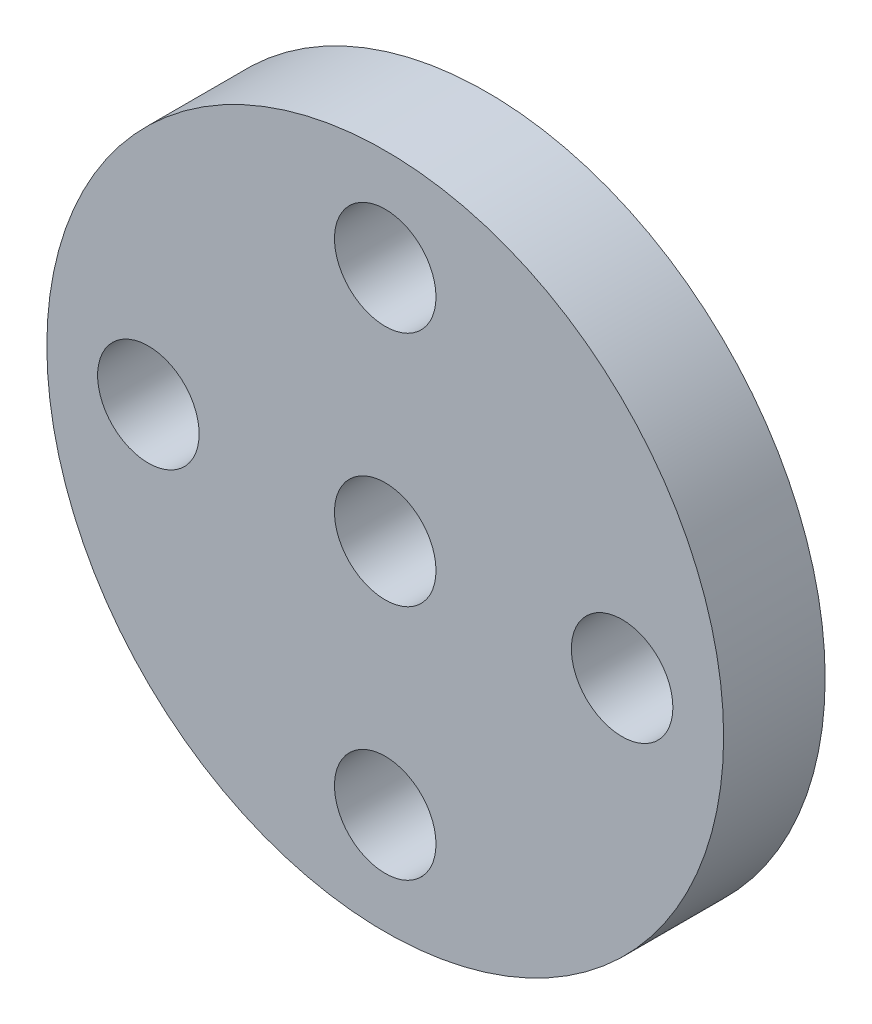
ISO-10303-21;
HEADER;
FILE_DESCRIPTION(('STEP AP214'),'2;1');
FILE_NAME('part.step','',(''),(''),'','','');
FILE_SCHEMA(('AUTOMOTIVE_DESIGN { 1 0 10303 214 1 1 1 1 }'));
ENDSEC;
DATA;
#1=APPLICATION_CONTEXT('core data for automotive mechanical design processes');
#2=APPLICATION_PROTOCOL_DEFINITION('international standard','automotive_design',2000,#1);
#3=PRODUCT_CONTEXT('',#1,'mechanical');
#4=PRODUCT('Part','Part','',(#3));
#5=PRODUCT_RELATED_PRODUCT_CATEGORY('part','',(#4));
#6=PRODUCT_DEFINITION_FORMATION('','',#4);
#7=PRODUCT_DEFINITION_CONTEXT('part definition',#1,'design');
#8=PRODUCT_DEFINITION('design','',#6,#7);
#9=PRODUCT_DEFINITION_SHAPE('','',#8);
#10=(LENGTH_UNIT() NAMED_UNIT(*) SI_UNIT(.MILLI.,.METRE.));
#11=(NAMED_UNIT(*) PLANE_ANGLE_UNIT() SI_UNIT($,.RADIAN.));
#12=(NAMED_UNIT(*) SI_UNIT($,.STERADIAN.) SOLID_ANGLE_UNIT());
#13=UNCERTAINTY_MEASURE_WITH_UNIT(LENGTH_MEASURE(1.E-05),#10,'distance_accuracy_value','');
#14=(GEOMETRIC_REPRESENTATION_CONTEXT(3) GLOBAL_UNCERTAINTY_ASSIGNED_CONTEXT((#13)) GLOBAL_UNIT_ASSIGNED_CONTEXT((#10,
#11,#12)) REPRESENTATION_CONTEXT('',''));
#15=CARTESIAN_POINT('',(0.,0.,0.));
#16=DIRECTION('',(0.,0.,1.));
#17=DIRECTION('',(1.,0.,0.));
#18=AXIS2_PLACEMENT_3D('',#15,#16,#17);
#19=CARTESIAN_POINT('',(0.,0.,3.));
#20=DIRECTION('',(0.,0.,1.));
#21=DIRECTION('',(1.,0.,0.));
#22=AXIS2_PLACEMENT_3D('',#19,#20,#21);
#23=PLANE('',#22);
#24=CARTESIAN_POINT('',(-7.00000000000001,0.,3.));
#25=DIRECTION('',(0.,0.,1.));
#26=DIRECTION('',(1.,0.,0.));
#27=AXIS2_PLACEMENT_3D('',#24,#25,#26);
#28=CIRCLE('',#27,1.5);
#29=CARTESIAN_POINT('',(-5.50000000000001,0.,3.));
#30=VERTEX_POINT('',#29);
#31=EDGE_CURVE('E72',#30,#30,#28,.T.);
#32=ORIENTED_EDGE('',*,*,#31,.F.);
#33=EDGE_LOOP('',(#32));
#34=FACE_BOUND('',#33,.T.);
#35=CARTESIAN_POINT('',(7.00000000000008,0.,3.));
#36=DIRECTION('',(0.,0.,1.));
#37=DIRECTION('',(1.,0.,0.));
#38=AXIS2_PLACEMENT_3D('',#35,#36,#37);
#39=CIRCLE('',#38,1.5);
#40=CARTESIAN_POINT('',(8.50000000000008,0.,3.));
#41=VERTEX_POINT('',#40);
#42=EDGE_CURVE('E56',#41,#41,#39,.T.);
#43=ORIENTED_EDGE('',*,*,#42,.F.);
#44=EDGE_LOOP('',(#43));
#45=FACE_BOUND('',#44,.T.);
#46=CARTESIAN_POINT('',(0.,0.,3.));
#47=DIRECTION('',(0.,0.,1.));
#48=DIRECTION('',(1.,0.,0.));
#49=AXIS2_PLACEMENT_3D('',#46,#47,#48);
#50=CIRCLE('',#49,10.);
#51=CARTESIAN_POINT('',(10.,0.,3.));
#52=VERTEX_POINT('',#51);
#53=EDGE_CURVE('E10',#52,#52,#50,.T.);
#54=ORIENTED_EDGE('',*,*,#53,.T.);
#55=EDGE_LOOP('',(#54));
#56=FACE_BOUND('',#55,.T.);
#57=CARTESIAN_POINT('',(0.,7.,3.));
#58=DIRECTION('',(0.,0.,1.));
#59=DIRECTION('',(1.,0.,0.));
#60=AXIS2_PLACEMENT_3D('',#57,#58,#59);
#61=CIRCLE('',#60,1.5);
#62=CARTESIAN_POINT('',(1.5,7.,3.));
#63=VERTEX_POINT('',#62);
#64=EDGE_CURVE('E50',#63,#63,#61,.T.);
#65=ORIENTED_EDGE('',*,*,#64,.F.);
#66=EDGE_LOOP('',(#65));
#67=FACE_BOUND('',#66,.T.);
#68=CARTESIAN_POINT('',(4.71844785465692E-13,-7.00000000000008,3.));
#69=DIRECTION('',(0.,0.,1.));
#70=DIRECTION('',(1.,0.,0.));
#71=AXIS2_PLACEMENT_3D('',#68,#69,#70);
#72=CIRCLE('',#71,1.50000000000043);
#73=CARTESIAN_POINT('',(1.5000000000009,-7.00000000000008,3.));
#74=VERTEX_POINT('',#73);
#75=EDGE_CURVE('E64',#74,#74,#72,.T.);
#76=ORIENTED_EDGE('',*,*,#75,.F.);
#77=EDGE_LOOP('',(#76));
#78=FACE_BOUND('',#77,.T.);
#79=CARTESIAN_POINT('',(0.,0.,3.));
#80=DIRECTION('',(0.,0.,1.));
#81=DIRECTION('',(1.,0.,0.));
#82=AXIS2_PLACEMENT_3D('',#79,#80,#81);
#83=CIRCLE('',#82,1.5);
#84=CARTESIAN_POINT('',(1.5,0.,3.));
#85=VERTEX_POINT('',#84);
#86=EDGE_CURVE('E80',#85,#85,#83,.T.);
#87=ORIENTED_EDGE('',*,*,#86,.F.);
#88=EDGE_LOOP('',(#87));
#89=FACE_BOUND('',#88,.T.);
#90=ADVANCED_FACE('F37',(#34,#45,#56,#67,#78,#89),#23,.T.);
#91=CARTESIAN_POINT('',(0.,0.,0.));
#92=DIRECTION('',(0.,0.,1.));
#93=DIRECTION('',(1.,0.,0.));
#94=AXIS2_PLACEMENT_3D('',#91,#92,#93);
#95=PLANE('',#94);
#96=CARTESIAN_POINT('',(0.,0.,0.));
#97=DIRECTION('',(0.,0.,1.));
#98=DIRECTION('',(1.,0.,0.));
#99=AXIS2_PLACEMENT_3D('',#96,#97,#98);
#100=CIRCLE('',#99,10.);
#101=CARTESIAN_POINT('',(10.,0.,0.));
#102=VERTEX_POINT('',#101);
#103=EDGE_CURVE('E41',#102,#102,#100,.T.);
#104=ORIENTED_EDGE('',*,*,#103,.F.);
#105=EDGE_LOOP('',(#104));
#106=FACE_BOUND('',#105,.T.);
#107=CARTESIAN_POINT('',(0.,7.,0.));
#108=DIRECTION('',(0.,0.,1.));
#109=DIRECTION('',(1.,0.,0.));
#110=AXIS2_PLACEMENT_3D('',#107,#108,#109);
#111=CIRCLE('',#110,1.5);
#112=CARTESIAN_POINT('',(1.5,7.,0.));
#113=VERTEX_POINT('',#112);
#114=EDGE_CURVE('E52',#113,#113,#111,.T.);
#115=ORIENTED_EDGE('',*,*,#114,.T.);
#116=EDGE_LOOP('',(#115));
#117=FACE_BOUND('',#116,.T.);
#118=CARTESIAN_POINT('',(7.00000000000008,0.,0.));
#119=DIRECTION('',(0.,0.,1.));
#120=DIRECTION('',(1.,0.,0.));
#121=AXIS2_PLACEMENT_3D('',#118,#119,#120);
#122=CIRCLE('',#121,1.5);
#123=CARTESIAN_POINT('',(8.50000000000008,0.,0.));
#124=VERTEX_POINT('',#123);
#125=EDGE_CURVE('E60',#124,#124,#122,.T.);
#126=ORIENTED_EDGE('',*,*,#125,.T.);
#127=EDGE_LOOP('',(#126));
#128=FACE_BOUND('',#127,.T.);
#129=CARTESIAN_POINT('',(4.71844785465692E-13,-7.00000000000008,0.));
#130=DIRECTION('',(0.,0.,1.));
#131=DIRECTION('',(1.,0.,0.));
#132=AXIS2_PLACEMENT_3D('',#129,#130,#131);
#133=CIRCLE('',#132,1.50000000000043);
#134=CARTESIAN_POINT('',(1.5000000000009,-7.00000000000008,0.));
#135=VERTEX_POINT('',#134);
#136=EDGE_CURVE('E68',#135,#135,#133,.T.);
#137=ORIENTED_EDGE('',*,*,#136,.T.);
#138=EDGE_LOOP('',(#137));
#139=FACE_BOUND('',#138,.T.);
#140=CARTESIAN_POINT('',(-7.00000000000001,0.,0.));
#141=DIRECTION('',(0.,0.,1.));
#142=DIRECTION('',(1.,0.,0.));
#143=AXIS2_PLACEMENT_3D('',#140,#141,#142);
#144=CIRCLE('',#143,1.5);
#145=CARTESIAN_POINT('',(-5.50000000000001,0.,0.));
#146=VERTEX_POINT('',#145);
#147=EDGE_CURVE('E76',#146,#146,#144,.T.);
#148=ORIENTED_EDGE('',*,*,#147,.T.);
#149=EDGE_LOOP('',(#148));
#150=FACE_BOUND('',#149,.T.);
#151=CARTESIAN_POINT('',(0.,0.,0.));
#152=DIRECTION('',(0.,0.,1.));
#153=DIRECTION('',(1.,0.,0.));
#154=AXIS2_PLACEMENT_3D('',#151,#152,#153);
#155=CIRCLE('',#154,1.5);
#156=CARTESIAN_POINT('',(1.5,0.,0.));
#157=VERTEX_POINT('',#156);
#158=EDGE_CURVE('E84',#157,#157,#155,.T.);
#159=ORIENTED_EDGE('',*,*,#158,.T.);
#160=EDGE_LOOP('',(#159));
#161=FACE_BOUND('',#160,.T.);
#162=ADVANCED_FACE('F96',(#106,#117,#128,#139,#150,#161),#95,.F.);
#163=CARTESIAN_POINT('',(0.,0.,3.));
#164=DIRECTION('',(0.,0.,-1.));
#165=DIRECTION('',(-1.,0.,0.));
#166=AXIS2_PLACEMENT_3D('',#163,#164,#165);
#167=CYLINDRICAL_SURFACE('',#166,10.);
#168=ORIENTED_EDGE('',*,*,#53,.F.);
#169=EDGE_LOOP('',(#168));
#170=FACE_BOUND('',#169,.T.);
#171=ORIENTED_EDGE('',*,*,#103,.T.);
#172=EDGE_LOOP('',(#171));
#173=FACE_BOUND('',#172,.T.);
#174=ADVANCED_FACE('F39',(#170,#173),#167,.T.);
#175=CARTESIAN_POINT('',(0.,7.,3.));
#176=DIRECTION('',(0.,0.,-1.));
#177=DIRECTION('',(-1.,0.,0.));
#178=AXIS2_PLACEMENT_3D('',#175,#176,#177);
#179=CYLINDRICAL_SURFACE('',#178,1.5);
#180=ORIENTED_EDGE('',*,*,#64,.T.);
#181=EDGE_LOOP('',(#180));
#182=FACE_BOUND('',#181,.T.);
#183=ORIENTED_EDGE('',*,*,#114,.F.);
#184=EDGE_LOOP('',(#183));
#185=FACE_BOUND('',#184,.T.);
#186=ADVANCED_FACE('F106',(#182,#185),#179,.F.);
#187=CARTESIAN_POINT('',(7.00000000000008,0.,3.));
#188=DIRECTION('',(0.,0.,-1.));
#189=DIRECTION('',(-1.,0.,0.));
#190=AXIS2_PLACEMENT_3D('',#187,#188,#189);
#191=CYLINDRICAL_SURFACE('',#190,1.5);
#192=ORIENTED_EDGE('',*,*,#42,.T.);
#193=EDGE_LOOP('',(#192));
#194=FACE_BOUND('',#193,.T.);
#195=ORIENTED_EDGE('',*,*,#125,.F.);
#196=EDGE_LOOP('',(#195));
#197=FACE_BOUND('',#196,.T.);
#198=ADVANCED_FACE('F109',(#194,#197),#191,.F.);
#199=CARTESIAN_POINT('',(4.71844785465692E-13,-7.00000000000008,3.));
#200=DIRECTION('',(0.,0.,-1.));
#201=DIRECTION('',(-1.,0.,0.));
#202=AXIS2_PLACEMENT_3D('',#199,#200,#201);
#203=CYLINDRICAL_SURFACE('',#202,1.50000000000043);
#204=ORIENTED_EDGE('',*,*,#75,.T.);
#205=EDGE_LOOP('',(#204));
#206=FACE_BOUND('',#205,.T.);
#207=ORIENTED_EDGE('',*,*,#136,.F.);
#208=EDGE_LOOP('',(#207));
#209=FACE_BOUND('',#208,.T.);
#210=ADVANCED_FACE('F113',(#206,#209),#203,.F.);
#211=CARTESIAN_POINT('',(-7.00000000000001,0.,3.));
#212=DIRECTION('',(0.,0.,-1.));
#213=DIRECTION('',(-1.,0.,0.));
#214=AXIS2_PLACEMENT_3D('',#211,#212,#213);
#215=CYLINDRICAL_SURFACE('',#214,1.5);
#216=ORIENTED_EDGE('',*,*,#31,.T.);
#217=EDGE_LOOP('',(#216));
#218=FACE_BOUND('',#217,.T.);
#219=ORIENTED_EDGE('',*,*,#147,.F.);
#220=EDGE_LOOP('',(#219));
#221=FACE_BOUND('',#220,.T.);
#222=ADVANCED_FACE('F117',(#218,#221),#215,.F.);
#223=CARTESIAN_POINT('',(0.,0.,3.));
#224=DIRECTION('',(0.,0.,-1.));
#225=DIRECTION('',(-1.,0.,0.));
#226=AXIS2_PLACEMENT_3D('',#223,#224,#225);
#227=CYLINDRICAL_SURFACE('',#226,1.5);
#228=ORIENTED_EDGE('',*,*,#86,.T.);
#229=EDGE_LOOP('',(#228));
#230=FACE_BOUND('',#229,.T.);
#231=ORIENTED_EDGE('',*,*,#158,.F.);
#232=EDGE_LOOP('',(#231));
#233=FACE_BOUND('',#232,.T.);
#234=ADVANCED_FACE('F92',(#230,#233),#227,.F.);
#235=CLOSED_SHELL('',(#90,#162,#174,#186,#198,#210,#222,#234));
#236=MANIFOLD_SOLID_BREP('B2',#235);
#237=ADVANCED_BREP_SHAPE_REPRESENTATION('',(#18,#236),#14);
#238=SHAPE_DEFINITION_REPRESENTATION(#9,#237);
ENDSEC;
END-ISO-10303-21;
